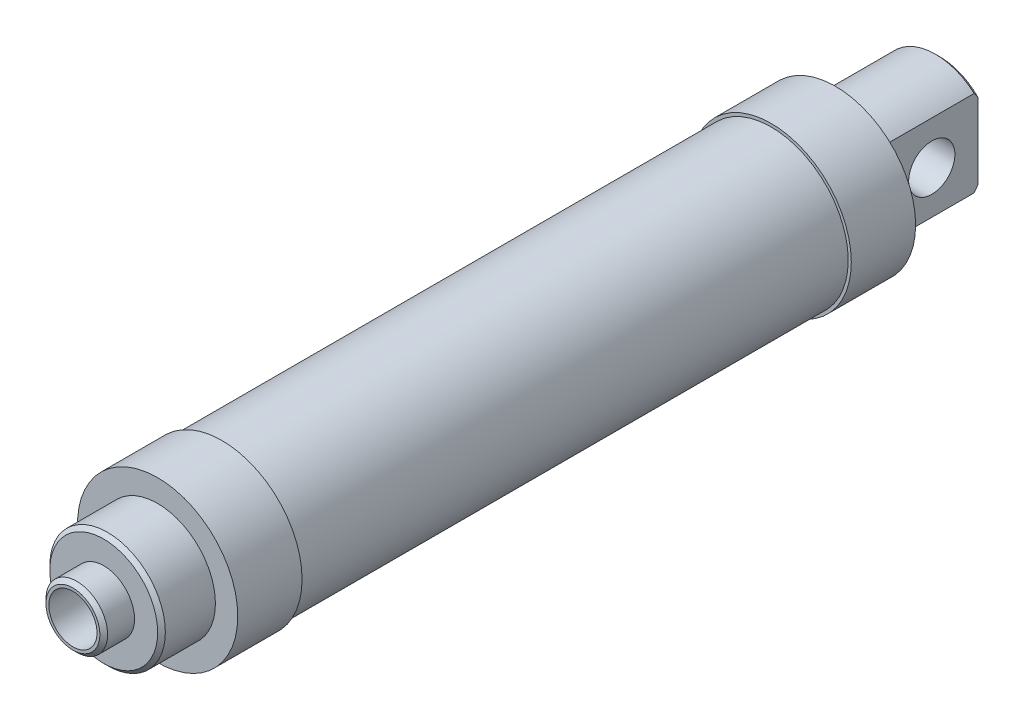
ISO-10303-21;
HEADER;
FILE_DESCRIPTION(('STEP AP214'),'2;1');
FILE_NAME('part.step','',(''),(''),'','','');
FILE_SCHEMA(('AUTOMOTIVE_DESIGN { 1 0 10303 214 1 1 1 1 }'));
ENDSEC;
DATA;
#1=APPLICATION_CONTEXT('core data for automotive mechanical design processes');
#2=APPLICATION_PROTOCOL_DEFINITION('international standard','automotive_design',2000,#1);
#3=PRODUCT_CONTEXT('',#1,'mechanical');
#4=PRODUCT('Part','Part','',(#3));
#5=PRODUCT_RELATED_PRODUCT_CATEGORY('part','',(#4));
#6=PRODUCT_DEFINITION_FORMATION('','',#4);
#7=PRODUCT_DEFINITION_CONTEXT('part definition',#1,'design');
#8=PRODUCT_DEFINITION('design','',#6,#7);
#9=PRODUCT_DEFINITION_SHAPE('','',#8);
#10=(LENGTH_UNIT() NAMED_UNIT(*) SI_UNIT(.MILLI.,.METRE.));
#11=(NAMED_UNIT(*) PLANE_ANGLE_UNIT() SI_UNIT($,.RADIAN.));
#12=(NAMED_UNIT(*) SI_UNIT($,.STERADIAN.) SOLID_ANGLE_UNIT());
#13=UNCERTAINTY_MEASURE_WITH_UNIT(LENGTH_MEASURE(1.E-05),#10,'distance_accuracy_value','');
#14=(GEOMETRIC_REPRESENTATION_CONTEXT(3) GLOBAL_UNCERTAINTY_ASSIGNED_CONTEXT((#13)) GLOBAL_UNIT_ASSIGNED_CONTEXT((#10,
#11,#12)) REPRESENTATION_CONTEXT('',''));
#15=CARTESIAN_POINT('',(0.,0.,0.));
#16=DIRECTION('',(0.,0.,1.));
#17=DIRECTION('',(1.,0.,0.));
#18=AXIS2_PLACEMENT_3D('',#15,#16,#17);
#19=CARTESIAN_POINT('',(0.,0.,142.6));
#20=DIRECTION('',(0.,0.,-1.));
#21=DIRECTION('',(-1.,0.,0.));
#22=AXIS2_PLACEMENT_3D('',#19,#20,#21);
#23=CYLINDRICAL_SURFACE('',#22,20.);
#24=CARTESIAN_POINT('',(0.,0.,142.6));
#25=DIRECTION('',(0.,0.,1.));
#26=DIRECTION('',(1.,0.,0.));
#27=AXIS2_PLACEMENT_3D('',#24,#25,#26);
#28=CIRCLE('',#27,20.);
#29=CARTESIAN_POINT('',(20.,0.,142.6));
#30=VERTEX_POINT('',#29);
#31=EDGE_CURVE('E131',#30,#30,#28,.T.);
#32=ORIENTED_EDGE('',*,*,#31,.F.);
#33=EDGE_LOOP('',(#32));
#34=FACE_BOUND('',#33,.T.);
#35=CARTESIAN_POINT('',(0.,0.,0.));
#36=DIRECTION('',(0.,0.,1.));
#37=DIRECTION('',(1.,0.,0.));
#38=AXIS2_PLACEMENT_3D('',#35,#36,#37);
#39=CIRCLE('',#38,20.);
#40=CARTESIAN_POINT('',(20.,0.,0.));
#41=VERTEX_POINT('',#40);
#42=EDGE_CURVE('E122',#41,#41,#39,.T.);
#43=ORIENTED_EDGE('',*,*,#42,.T.);
#44=EDGE_LOOP('',(#43));
#45=FACE_BOUND('',#44,.T.);
#46=ADVANCED_FACE('F33',(#34,#45),#23,.T.);
#47=CARTESIAN_POINT('',(0.,0.,159.3));
#48=DIRECTION('',(0.,0.,-1.));
#49=DIRECTION('',(-1.,0.,0.));
#50=AXIS2_PLACEMENT_3D('',#47,#48,#49);
#51=CYLINDRICAL_SURFACE('',#50,20.8);
#52=CARTESIAN_POINT('',(0.,0.,159.3));
#53=DIRECTION('',(0.,0.,1.));
#54=DIRECTION('',(1.,0.,0.));
#55=AXIS2_PLACEMENT_3D('',#52,#53,#54);
#56=CIRCLE('',#55,20.8);
#57=CARTESIAN_POINT('',(20.8,0.,159.3));
#58=VERTEX_POINT('',#57);
#59=EDGE_CURVE('E128',#58,#58,#56,.T.);
#60=ORIENTED_EDGE('',*,*,#59,.F.);
#61=EDGE_LOOP('',(#60));
#62=FACE_BOUND('',#61,.T.);
#63=CARTESIAN_POINT('',(0.,0.,142.6));
#64=DIRECTION('',(0.,0.,1.));
#65=DIRECTION('',(1.,0.,0.));
#66=AXIS2_PLACEMENT_3D('',#63,#64,#65);
#67=CIRCLE('',#66,20.8);
#68=CARTESIAN_POINT('',(20.8,0.,142.6));
#69=VERTEX_POINT('',#68);
#70=EDGE_CURVE('E127',#69,#69,#67,.T.);
#71=ORIENTED_EDGE('',*,*,#70,.T.);
#72=EDGE_LOOP('',(#71));
#73=FACE_BOUND('',#72,.T.);
#74=ADVANCED_FACE('F197',(#62,#73),#51,.T.);
#75=CARTESIAN_POINT('',(0.,0.,159.3));
#76=DIRECTION('',(0.,0.,1.));
#77=DIRECTION('',(1.,0.,0.));
#78=AXIS2_PLACEMENT_3D('',#75,#76,#77);
#79=PLANE('',#78);
#80=CARTESIAN_POINT('',(0.,0.,159.3));
#81=DIRECTION('',(0.,0.,1.));
#82=DIRECTION('',(1.,0.,0.));
#83=AXIS2_PLACEMENT_3D('',#80,#81,#82);
#84=CIRCLE('',#83,15.);
#85=CARTESIAN_POINT('',(15.,0.,159.3));
#86=VERTEX_POINT('',#85);
#87=EDGE_CURVE('E269',#86,#86,#84,.T.);
#88=ORIENTED_EDGE('',*,*,#87,.F.);
#89=EDGE_LOOP('',(#88));
#90=FACE_BOUND('',#89,.T.);
#91=ORIENTED_EDGE('',*,*,#59,.T.);
#92=EDGE_LOOP('',(#91));
#93=FACE_BOUND('',#92,.T.);
#94=ADVANCED_FACE('F194',(#90,#93),#79,.T.);
#95=CARTESIAN_POINT('',(0.,0.,142.6));
#96=DIRECTION('',(0.,0.,1.));
#97=DIRECTION('',(1.,0.,0.));
#98=AXIS2_PLACEMENT_3D('',#95,#96,#97);
#99=PLANE('',#98);
#100=ORIENTED_EDGE('',*,*,#31,.T.);
#101=EDGE_LOOP('',(#100));
#102=FACE_BOUND('',#101,.T.);
#103=ORIENTED_EDGE('',*,*,#70,.F.);
#104=EDGE_LOOP('',(#103));
#105=FACE_BOUND('',#104,.T.);
#106=ADVANCED_FACE('F192',(#102,#105),#99,.F.);
#107=CARTESIAN_POINT('',(0.,0.,-16.7));
#108=DIRECTION('',(0.,0.,1.));
#109=DIRECTION('',(1.,0.,0.));
#110=AXIS2_PLACEMENT_3D('',#107,#108,#109);
#111=CYLINDRICAL_SURFACE('',#110,20.8);
#112=CARTESIAN_POINT('',(0.,0.,-16.7));
#113=DIRECTION('',(0.,0.,1.));
#114=DIRECTION('',(1.,0.,0.));
#115=AXIS2_PLACEMENT_3D('',#112,#113,#114);
#116=CIRCLE('',#115,20.8);
#117=CARTESIAN_POINT('',(20.8,0.,-16.7));
#118=VERTEX_POINT('',#117);
#119=EDGE_CURVE('E119',#118,#118,#116,.T.);
#120=ORIENTED_EDGE('',*,*,#119,.T.);
#121=EDGE_LOOP('',(#120));
#122=FACE_BOUND('',#121,.T.);
#123=CARTESIAN_POINT('',(0.,0.,0.));
#124=DIRECTION('',(0.,0.,1.));
#125=DIRECTION('',(1.,0.,0.));
#126=AXIS2_PLACEMENT_3D('',#123,#124,#125);
#127=CIRCLE('',#126,20.8);
#128=CARTESIAN_POINT('',(20.8,0.,0.));
#129=VERTEX_POINT('',#128);
#130=EDGE_CURVE('E118',#129,#129,#127,.T.);
#131=ORIENTED_EDGE('',*,*,#130,.F.);
#132=EDGE_LOOP('',(#131));
#133=FACE_BOUND('',#132,.T.);
#134=ADVANCED_FACE('F185',(#122,#133),#111,.T.);
#135=CARTESIAN_POINT('',(0.,0.,-16.7));
#136=DIRECTION('',(0.,0.,1.));
#137=DIRECTION('',(1.,0.,0.));
#138=AXIS2_PLACEMENT_3D('',#135,#136,#137);
#139=PLANE('',#138);
#140=CARTESIAN_POINT('',(0.,0.,-16.7));
#141=DIRECTION('',(0.,0.,1.));
#142=DIRECTION('',(1.,0.,0.));
#143=AXIS2_PLACEMENT_3D('',#140,#141,#142);
#144=CIRCLE('',#143,15.);
#145=CARTESIAN_POINT('',(15.,0.,-16.7));
#146=VERTEX_POINT('',#145);
#147=EDGE_CURVE('E136',#146,#146,#144,.F.);
#148=ORIENTED_EDGE('',*,*,#147,.F.);
#149=EDGE_LOOP('',(#148));
#150=FACE_BOUND('',#149,.T.);
#151=ORIENTED_EDGE('',*,*,#119,.F.);
#152=EDGE_LOOP('',(#151));
#153=FACE_BOUND('',#152,.T.);
#154=ADVANCED_FACE('F182',(#150,#153),#139,.F.);
#155=CARTESIAN_POINT('',(0.,0.,0.));
#156=DIRECTION('',(0.,0.,1.));
#157=DIRECTION('',(1.,0.,0.));
#158=AXIS2_PLACEMENT_3D('',#155,#156,#157);
#159=PLANE('',#158);
#160=ORIENTED_EDGE('',*,*,#42,.F.);
#161=EDGE_LOOP('',(#160));
#162=FACE_BOUND('',#161,.T.);
#163=ORIENTED_EDGE('',*,*,#130,.T.);
#164=EDGE_LOOP('',(#163));
#165=FACE_BOUND('',#164,.T.);
#166=ADVANCED_FACE('F181',(#162,#165),#159,.T.);
#167=CARTESIAN_POINT('',(0.,0.,-43.7));
#168=DIRECTION('',(0.,0.,1.));
#169=DIRECTION('',(1.,0.,0.));
#170=AXIS2_PLACEMENT_3D('',#167,#168,#169);
#171=CYLINDRICAL_SURFACE('',#170,15.);
#172=DIRECTION('',(0.,0.,1.));
#173=VECTOR('',#172,1.);
#174=CARTESIAN_POINT('',(9.99999999999999,11.180339887499,-43.7));
#175=LINE('',#174,#173);
#176=CARTESIAN_POINT('',(10.,11.180339887499,-17.7));
#177=VERTEX_POINT('',#176);
#178=CARTESIAN_POINT('',(9.99999999999999,11.180339887499,-42.7));
#179=VERTEX_POINT('',#178);
#180=EDGE_CURVE('E114',#177,#179,#175,.F.);
#181=ORIENTED_EDGE('',*,*,#180,.T.);
#182=CARTESIAN_POINT('',(0.,0.,-42.7));
#183=DIRECTION('',(0.,0.,-1.));
#184=DIRECTION('',(-1.,0.,0.));
#185=AXIS2_PLACEMENT_3D('',#182,#183,#184);
#186=CIRCLE('',#185,15.);
#187=CARTESIAN_POINT('',(-9.99999999999999,11.180339887499,-42.7));
#188=VERTEX_POINT('',#187);
#189=EDGE_CURVE('E56',#179,#188,#186,.F.);
#190=ORIENTED_EDGE('',*,*,#189,.T.);
#191=DIRECTION('',(0.,0.,1.));
#192=VECTOR('',#191,1.);
#193=CARTESIAN_POINT('',(-9.99999999999999,11.180339887499,-43.7));
#194=LINE('',#193,#192);
#195=CARTESIAN_POINT('',(-10.,11.180339887499,-17.7));
#196=VERTEX_POINT('',#195);
#197=EDGE_CURVE('E85',#188,#196,#194,.T.);
#198=ORIENTED_EDGE('',*,*,#197,.T.);
#199=CARTESIAN_POINT('',(0.,0.,-17.7));
#200=DIRECTION('',(0.,0.,1.));
#201=DIRECTION('',(1.,0.,0.));
#202=AXIS2_PLACEMENT_3D('',#199,#200,#201);
#203=CIRCLE('',#202,15.);
#204=CARTESIAN_POINT('',(-10.,-11.180339887499,-17.7));
#205=VERTEX_POINT('',#204);
#206=EDGE_CURVE('E89',#196,#205,#203,.T.);
#207=ORIENTED_EDGE('',*,*,#206,.T.);
#208=DIRECTION('',(0.,0.,1.));
#209=VECTOR('',#208,1.);
#210=CARTESIAN_POINT('',(-9.99999999999999,-11.180339887499,-43.7));
#211=LINE('',#210,#209);
#212=CARTESIAN_POINT('',(-9.99999999999999,-11.180339887499,-42.7));
#213=VERTEX_POINT('',#212);
#214=EDGE_CURVE('E93',#205,#213,#211,.F.);
#215=ORIENTED_EDGE('',*,*,#214,.T.);
#216=CARTESIAN_POINT('',(0.,0.,-42.7));
#217=DIRECTION('',(0.,0.,-1.));
#218=DIRECTION('',(-1.,0.,0.));
#219=AXIS2_PLACEMENT_3D('',#216,#217,#218);
#220=CIRCLE('',#219,15.);
#221=CARTESIAN_POINT('',(9.99999999999999,-11.180339887499,-42.7));
#222=VERTEX_POINT('',#221);
#223=EDGE_CURVE('E288',#213,#222,#220,.F.);
#224=ORIENTED_EDGE('',*,*,#223,.T.);
#225=DIRECTION('',(0.,0.,1.));
#226=VECTOR('',#225,1.);
#227=CARTESIAN_POINT('',(9.99999999999999,-11.180339887499,-43.7));
#228=LINE('',#227,#226);
#229=CARTESIAN_POINT('',(10.,-11.180339887499,-17.7));
#230=VERTEX_POINT('',#229);
#231=EDGE_CURVE('E116',#222,#230,#228,.T.);
#232=ORIENTED_EDGE('',*,*,#231,.T.);
#233=CARTESIAN_POINT('',(0.,0.,-17.7));
#234=DIRECTION('',(0.,0.,1.));
#235=DIRECTION('',(1.,0.,0.));
#236=AXIS2_PLACEMENT_3D('',#233,#234,#235);
#237=CIRCLE('',#236,15.);
#238=EDGE_CURVE('E142',#230,#177,#237,.T.);
#239=ORIENTED_EDGE('',*,*,#238,.T.);
#240=EDGE_LOOP('',(#181,#190,#198,#207,#215,#224,#232,#239));
#241=FACE_BOUND('',#240,.T.);
#242=ORIENTED_EDGE('',*,*,#147,.T.);
#243=EDGE_LOOP('',(#242));
#244=FACE_BOUND('',#243,.T.);
#245=ADVANCED_FACE('F87',(#241,#244),#171,.T.);
#246=CARTESIAN_POINT('',(0.,0.,-43.7));
#247=DIRECTION('',(0.,0.,-1.));
#248=DIRECTION('',(-1.,0.,0.));
#249=AXIS2_PLACEMENT_3D('',#246,#247,#248);
#250=PLANE('',#249);
#251=DIRECTION('',(0.,-1.,0.));
#252=VECTOR('',#251,1.);
#253=CARTESIAN_POINT('',(-10.,0.,-43.7));
#254=LINE('',#253,#252);
#255=CARTESIAN_POINT('',(-10.,9.79795897113273,-43.7));
#256=VERTEX_POINT('',#255);
#257=CARTESIAN_POINT('',(-10.,-9.79795897113273,-43.7));
#258=VERTEX_POINT('',#257);
#259=EDGE_CURVE('E100',#256,#258,#254,.T.);
#260=ORIENTED_EDGE('',*,*,#259,.F.);
#261=CARTESIAN_POINT('',(0.,0.,-43.7));
#262=DIRECTION('',(0.,0.,-1.));
#263=DIRECTION('',(-1.,0.,0.));
#264=AXIS2_PLACEMENT_3D('',#261,#262,#263);
#265=CIRCLE('',#264,14.);
#266=CARTESIAN_POINT('',(10.,9.79795897113273,-43.7));
#267=VERTEX_POINT('',#266);
#268=EDGE_CURVE('E148',#256,#267,#265,.T.);
#269=ORIENTED_EDGE('',*,*,#268,.T.);
#270=DIRECTION('',(0.,1.,0.));
#271=VECTOR('',#270,1.);
#272=CARTESIAN_POINT('',(10.,0.,-43.7));
#273=LINE('',#272,#271);
#274=CARTESIAN_POINT('',(10.,-9.79795897113273,-43.7));
#275=VERTEX_POINT('',#274);
#276=EDGE_CURVE('E139',#275,#267,#273,.T.);
#277=ORIENTED_EDGE('',*,*,#276,.F.);
#278=CARTESIAN_POINT('',(0.,0.,-43.7));
#279=DIRECTION('',(0.,0.,-1.));
#280=DIRECTION('',(-1.,0.,0.));
#281=AXIS2_PLACEMENT_3D('',#278,#279,#280);
#282=CIRCLE('',#281,14.);
#283=EDGE_CURVE('E99',#275,#258,#282,.T.);
#284=ORIENTED_EDGE('',*,*,#283,.T.);
#285=EDGE_LOOP('',(#260,#269,#277,#284));
#286=FACE_BOUND('',#285,.T.);
#287=ADVANCED_FACE('F174',(#286),#250,.T.);
#288=CARTESIAN_POINT('',(0.,0.,-17.7));
#289=DIRECTION('',(0.,0.,1.));
#290=DIRECTION('',(1.,0.,0.));
#291=AXIS2_PLACEMENT_3D('',#288,#289,#290);
#292=PLANE('',#291);
#293=DIRECTION('',(0.,1.,0.));
#294=VECTOR('',#293,1.);
#295=CARTESIAN_POINT('',(10.,15.,-17.7));
#296=LINE('',#295,#294);
#297=EDGE_CURVE('E92',#230,#177,#296,.T.);
#298=ORIENTED_EDGE('',*,*,#297,.T.);
#299=ORIENTED_EDGE('',*,*,#238,.F.);
#300=EDGE_LOOP('',(#298,#299));
#301=FACE_BOUND('',#300,.T.);
#302=ADVANCED_FACE('F171',(#301),#292,.F.);
#303=CARTESIAN_POINT('',(10.,15.,-17.7));
#304=DIRECTION('',(-1.,0.,0.));
#305=DIRECTION('',(0.,0.,1.));
#306=AXIS2_PLACEMENT_3D('',#303,#304,#305);
#307=PLANE('',#306);
#308=CARTESIAN_POINT('',(10.,0.,-31.7));
#309=DIRECTION('',(1.,0.,0.));
#310=DIRECTION('',(0.,0.,-1.));
#311=AXIS2_PLACEMENT_3D('',#308,#309,#310);
#312=CIRCLE('',#311,6.);
#313=CARTESIAN_POINT('',(10.,0.,-37.7));
#314=VERTEX_POINT('',#313);
#315=EDGE_CURVE('E107',#314,#314,#312,.T.);
#316=ORIENTED_EDGE('',*,*,#315,.F.);
#317=EDGE_LOOP('',(#316));
#318=FACE_BOUND('',#317,.T.);
#319=ORIENTED_EDGE('',*,*,#276,.T.);
#320=CARTESIAN_POINT('',(10.,9.79795897113273,-43.7));
#321=CARTESIAN_POINT('',(10.,9.9144528340522,-43.6184698842031));
#322=CARTESIAN_POINT('',(10.,10.0305989753392,-43.5364440774601));
#323=CARTESIAN_POINT('',(10.,10.2622268930584,-43.3714731324367));
#324=CARTESIAN_POINT('',(10.,10.3777087061234,-43.2885280456002));
#325=CARTESIAN_POINT('',(10.,10.6080513507817,-43.1217819738915));
#326=CARTESIAN_POINT('',(10.,10.7229121859285,-43.0379809939246));
#327=CARTESIAN_POINT('',(10.,10.9520540255817,-42.8695765798571));
#328=CARTESIAN_POINT('',(10.,11.0663349974492,-42.7849731013384));
#329=CARTESIAN_POINT('',(10.,11.180339887499,-42.7));
#330=B_SPLINE_CURVE_WITH_KNOTS('',3,(#320,#321,#322,#323,#324,#325,#326,#327,#328,#329),
.UNSPECIFIED.,.F.,.F.,(4,2,2,2,4),(0.,0.426567590976712,0.853111430127962,1.27965282597467,
1.70621797007618),.UNSPECIFIED.);
#331=EDGE_CURVE('E158',#267,#179,#330,.T.);
#332=ORIENTED_EDGE('',*,*,#331,.T.);
#333=ORIENTED_EDGE('',*,*,#180,.F.);
#334=ORIENTED_EDGE('',*,*,#297,.F.);
#335=ORIENTED_EDGE('',*,*,#231,.F.);
#336=CARTESIAN_POINT('',(9.99999999999999,-11.180339887499,-42.7));
#337=CARTESIAN_POINT('',(10.,-11.0663349974492,-42.7849731013384));
#338=CARTESIAN_POINT('',(10.,-10.9520540255817,-42.869576579857));
#339=CARTESIAN_POINT('',(10.,-10.7229121859285,-43.0379809939246));
#340=CARTESIAN_POINT('',(10.,-10.6080513507818,-43.1217819738915));
#341=CARTESIAN_POINT('',(10.,-10.3777087061234,-43.2885280456002));
#342=CARTESIAN_POINT('',(10.,-10.2622268930584,-43.3714731324367));
#343=CARTESIAN_POINT('',(10.,-10.0305989753392,-43.5364440774601));
#344=CARTESIAN_POINT('',(10.,-9.91445283405221,-43.6184698842031));
#345=CARTESIAN_POINT('',(10.,-9.79795897113276,-43.7));
#346=B_SPLINE_CURVE_WITH_KNOTS('',3,(#336,#337,#338,#339,#340,#341,#342,#343,#344,#345),
.UNSPECIFIED.,.F.,.F.,(4,2,2,2,4),(0.,0.426565144101508,0.853106539948218,1.27965037909946,
1.70621797007618),.UNSPECIFIED.);
#347=EDGE_CURVE('E151',#222,#275,#346,.T.);
#348=ORIENTED_EDGE('',*,*,#347,.T.);
#349=EDGE_LOOP('',(#319,#332,#333,#334,#335,#348));
#350=FACE_BOUND('',#349,.T.);
#351=ADVANCED_FACE('F166',(#318,#350),#307,.F.);
#352=CARTESIAN_POINT('',(0.,0.,-17.7));
#353=DIRECTION('',(0.,0.,1.));
#354=DIRECTION('',(1.,0.,0.));
#355=AXIS2_PLACEMENT_3D('',#352,#353,#354);
#356=PLANE('',#355);
#357=DIRECTION('',(0.,-1.,0.));
#358=VECTOR('',#357,1.);
#359=CARTESIAN_POINT('',(-10.,15.,-17.7));
#360=LINE('',#359,#358);
#361=EDGE_CURVE('E98',#196,#205,#360,.T.);
#362=ORIENTED_EDGE('',*,*,#361,.T.);
#363=ORIENTED_EDGE('',*,*,#206,.F.);
#364=EDGE_LOOP('',(#362,#363));
#365=FACE_BOUND('',#364,.T.);
#366=ADVANCED_FACE('F97',(#365),#356,.F.);
#367=CARTESIAN_POINT('',(-10.,15.,-17.7));
#368=DIRECTION('',(1.,0.,0.));
#369=DIRECTION('',(0.,0.,-1.));
#370=AXIS2_PLACEMENT_3D('',#367,#368,#369);
#371=PLANE('',#370);
#372=CARTESIAN_POINT('',(-10.,0.,-31.7));
#373=DIRECTION('',(1.,0.,0.));
#374=DIRECTION('',(0.,0.,-1.));
#375=AXIS2_PLACEMENT_3D('',#372,#373,#374);
#376=CIRCLE('',#375,6.);
#377=CARTESIAN_POINT('',(-10.,0.,-37.7));
#378=VERTEX_POINT('',#377);
#379=EDGE_CURVE('E103',#378,#378,#376,.T.);
#380=ORIENTED_EDGE('',*,*,#379,.T.);
#381=EDGE_LOOP('',(#380));
#382=FACE_BOUND('',#381,.T.);
#383=ORIENTED_EDGE('',*,*,#197,.F.);
#384=CARTESIAN_POINT('',(-9.99999999999999,11.180339887499,-42.7));
#385=CARTESIAN_POINT('',(-10.,11.0663349974492,-42.7849731013384));
#386=CARTESIAN_POINT('',(-10.,10.9520540255817,-42.869576579857));
#387=CARTESIAN_POINT('',(-10.,10.7229121859285,-43.0379809939246));
#388=CARTESIAN_POINT('',(-10.,10.6080513507818,-43.1217819738915));
#389=CARTESIAN_POINT('',(-10.,10.3777087061234,-43.2885280456002));
#390=CARTESIAN_POINT('',(-10.,10.2622268930584,-43.3714731324367));
#391=CARTESIAN_POINT('',(-10.,10.0305989753392,-43.5364440774601));
#392=CARTESIAN_POINT('',(-10.,9.91445283405221,-43.6184698842031));
#393=CARTESIAN_POINT('',(-10.,9.79795897113276,-43.7));
#394=B_SPLINE_CURVE_WITH_KNOTS('',3,(#384,#385,#386,#387,#388,#389,#390,#391,#392,#393),
.UNSPECIFIED.,.F.,.F.,(4,2,2,2,4),(0.,0.426565144101508,0.853106539948218,1.27965037909946,
1.70621797007618),.UNSPECIFIED.);
#395=EDGE_CURVE('E214',#188,#256,#394,.T.);
#396=ORIENTED_EDGE('',*,*,#395,.T.);
#397=ORIENTED_EDGE('',*,*,#259,.T.);
#398=CARTESIAN_POINT('',(-10.,-9.79795897113273,-43.7));
#399=CARTESIAN_POINT('',(-10.,-9.9144528340522,-43.6184698842031));
#400=CARTESIAN_POINT('',(-10.,-10.0305989753392,-43.5364440774601));
#401=CARTESIAN_POINT('',(-10.,-10.2622268930584,-43.3714731324367));
#402=CARTESIAN_POINT('',(-10.,-10.3777087061234,-43.2885280456002));
#403=CARTESIAN_POINT('',(-10.,-10.6080513507817,-43.1217819738915));
#404=CARTESIAN_POINT('',(-10.,-10.7229121859285,-43.0379809939246));
#405=CARTESIAN_POINT('',(-10.,-10.9520540255817,-42.8695765798571));
#406=CARTESIAN_POINT('',(-10.,-11.0663349974492,-42.7849731013384));
#407=CARTESIAN_POINT('',(-10.,-11.180339887499,-42.7));
#408=B_SPLINE_CURVE_WITH_KNOTS('',3,(#398,#399,#400,#401,#402,#403,#404,#405,#406,#407),
.UNSPECIFIED.,.F.,.F.,(4,2,2,2,4),(0.,0.426567590976712,0.853111430127962,1.27965282597467,
1.70621797007618),.UNSPECIFIED.);
#409=EDGE_CURVE('E48',#258,#213,#408,.T.);
#410=ORIENTED_EDGE('',*,*,#409,.T.);
#411=ORIENTED_EDGE('',*,*,#214,.F.);
#412=ORIENTED_EDGE('',*,*,#361,.F.);
#413=EDGE_LOOP('',(#383,#396,#397,#410,#411,#412));
#414=FACE_BOUND('',#413,.T.);
#415=ADVANCED_FACE('F102',(#382,#414),#371,.F.);
#416=CARTESIAN_POINT('',(-20.8,0.,-31.7));
#417=DIRECTION('',(1.,0.,0.));
#418=DIRECTION('',(0.,0.,-1.));
#419=AXIS2_PLACEMENT_3D('',#416,#417,#418);
#420=CYLINDRICAL_SURFACE('',#419,6.);
#421=CARTESIAN_POINT('',(10.,0.,-37.7));
#422=CARTESIAN_POINT('',(9.79166666666667,0.,-37.7));
#423=CARTESIAN_POINT('',(9.58333333333333,0.,-37.7));
#424=CARTESIAN_POINT('',(9.16666666666666,0.,-37.7));
#425=CARTESIAN_POINT('',(8.95833333333333,0.,-37.7));
#426=CARTESIAN_POINT('',(8.54166666666666,0.,-37.7));
#427=CARTESIAN_POINT('',(8.33333333333333,0.,-37.7));
#428=CARTESIAN_POINT('',(7.91666666666666,0.,-37.7));
#429=CARTESIAN_POINT('',(7.70833333333333,0.,-37.7));
#430=CARTESIAN_POINT('',(7.29166666666667,0.,-37.7));
#431=CARTESIAN_POINT('',(7.08333333333333,0.,-37.7));
#432=CARTESIAN_POINT('',(6.66666666666667,0.,-37.7));
#433=CARTESIAN_POINT('',(6.45833333333333,0.,-37.7));
#434=CARTESIAN_POINT('',(6.04166666666667,0.,-37.7));
#435=CARTESIAN_POINT('',(5.83333333333333,0.,-37.7));
#436=CARTESIAN_POINT('',(5.41666666666666,0.,-37.7));
#437=CARTESIAN_POINT('',(5.20833333333333,0.,-37.7));
#438=CARTESIAN_POINT('',(4.79166666666667,0.,-37.7));
#439=CARTESIAN_POINT('',(4.58333333333333,0.,-37.7));
#440=CARTESIAN_POINT('',(4.16666666666667,0.,-37.7));
#441=CARTESIAN_POINT('',(3.95833333333333,0.,-37.7));
#442=CARTESIAN_POINT('',(3.54166666666667,0.,-37.7));
#443=CARTESIAN_POINT('',(3.33333333333333,0.,-37.7));
#444=CARTESIAN_POINT('',(2.91666666666667,0.,-37.7));
#445=CARTESIAN_POINT('',(2.70833333333333,0.,-37.7));
#446=CARTESIAN_POINT('',(2.29166666666667,0.,-37.7));
#447=CARTESIAN_POINT('',(2.08333333333333,0.,-37.7));
#448=CARTESIAN_POINT('',(1.66666666666666,0.,-37.7));
#449=CARTESIAN_POINT('',(1.45833333333333,0.,-37.7));
#450=CARTESIAN_POINT('',(1.04166666666666,0.,-37.7));
#451=CARTESIAN_POINT('',(0.833333333333331,0.,-37.7));
#452=CARTESIAN_POINT('',(0.416666666666664,0.,-37.7));
#453=CARTESIAN_POINT('',(0.20833333333333,0.,-37.7));
#454=CARTESIAN_POINT('',(-0.208333333333337,0.,-37.7));
#455=CARTESIAN_POINT('',(-0.416666666666671,0.,-37.7));
#456=CARTESIAN_POINT('',(-0.833333333333336,0.,-37.7));
#457=CARTESIAN_POINT('',(-1.04166666666667,0.,-37.7));
#458=CARTESIAN_POINT('',(-1.45833333333333,0.,-37.7));
#459=CARTESIAN_POINT('',(-1.66666666666667,0.,-37.7));
#460=CARTESIAN_POINT('',(-2.08333333333334,0.,-37.7));
#461=CARTESIAN_POINT('',(-2.29166666666667,0.,-37.7));
#462=CARTESIAN_POINT('',(-2.70833333333333,0.,-37.7));
#463=CARTESIAN_POINT('',(-2.91666666666667,0.,-37.7));
#464=CARTESIAN_POINT('',(-3.33333333333333,0.,-37.7));
#465=CARTESIAN_POINT('',(-3.54166666666667,0.,-37.7));
#466=CARTESIAN_POINT('',(-3.95833333333333,0.,-37.7));
#467=CARTESIAN_POINT('',(-4.16666666666667,0.,-37.7));
#468=CARTESIAN_POINT('',(-4.58333333333333,0.,-37.7));
#469=CARTESIAN_POINT('',(-4.79166666666667,0.,-37.7));
#470=CARTESIAN_POINT('',(-5.20833333333333,0.,-37.7));
#471=CARTESIAN_POINT('',(-5.41666666666667,0.,-37.7));
#472=CARTESIAN_POINT('',(-5.83333333333333,0.,-37.7));
#473=CARTESIAN_POINT('',(-6.04166666666667,0.,-37.7));
#474=CARTESIAN_POINT('',(-6.45833333333333,0.,-37.7));
#475=CARTESIAN_POINT('',(-6.66666666666667,0.,-37.7));
#476=CARTESIAN_POINT('',(-7.08333333333333,0.,-37.7));
#477=CARTESIAN_POINT('',(-7.29166666666667,0.,-37.7));
#478=CARTESIAN_POINT('',(-7.70833333333333,0.,-37.7));
#479=CARTESIAN_POINT('',(-7.91666666666667,0.,-37.7));
#480=CARTESIAN_POINT('',(-8.33333333333333,0.,-37.7));
#481=CARTESIAN_POINT('',(-8.54166666666667,0.,-37.7));
#482=CARTESIAN_POINT('',(-8.95833333333333,0.,-37.7));
#483=CARTESIAN_POINT('',(-9.16666666666667,0.,-37.7));
#484=CARTESIAN_POINT('',(-9.58333333333333,0.,-37.7));
#485=CARTESIAN_POINT('',(-9.79166666666667,0.,-37.7));
#486=CARTESIAN_POINT('',(-10.,0.,-37.7));
#487=B_SPLINE_CURVE_WITH_KNOTS('',3,(#421,#422,#423,#424,#425,#426,#427,#428,#429,#430,#431,
#432,#433,#434,#435,#436,#437,#438,#439,#440,#441,#442,#443,#444,#445,#446,#447,#448,#449,#450,
#451,#452,#453,#454,#455,#456,#457,#458,#459,#460,#461,#462,#463,#464,#465,#466,#467,#468,#469,
#470,#471,#472,#473,#474,#475,#476,#477,#478,#479,#480,#481,#482,#483,#484,#485,#486),
.UNSPECIFIED.,.F.,.F.,(4,2,2,2,2,2,2,2,2,2,2,2,2,2,2,2,2,2,2,2,2,2,2,2,2,2,2,2,2,2,2,2,4),(0.,
0.625000000000001,1.25,1.875,2.5,3.125,3.75,4.375,5.,5.625,6.25,6.875,7.5,8.125,8.75,9.375,10.,
10.625,11.25,11.875,12.5,13.125,13.75,14.375,15.,15.625,16.25,16.875,17.5,18.125,18.75,19.375,
20.),.UNSPECIFIED.);
#488=EDGE_CURVE('BSEAM210',#314,#378,#487,.T.);
#489=ORIENTED_EDGE('',*,*,#315,.T.);
#490=ORIENTED_EDGE('',*,*,#379,.F.);
#491=ORIENTED_EDGE('',*,*,#488,.T.);
#492=ORIENTED_EDGE('',*,*,#488,.F.);
#493=EDGE_LOOP('',(#489,#491,#490,#492));
#494=FACE_BOUND('',#493,.T.);
#495=ADVANCED_FACE('F210',(#494),#420,.F.);
#496=CARTESIAN_POINT('',(0.,0.,-43.7));
#497=DIRECTION('',(0.,0.,1.));
#498=DIRECTION('',(1.,0.,0.));
#499=AXIS2_PLACEMENT_3D('',#496,#497,#498);
#500=CONICAL_SURFACE('',#499,14.,0.785398163397435);
#501=ORIENTED_EDGE('',*,*,#395,.F.);
#502=ORIENTED_EDGE('',*,*,#189,.F.);
#503=ORIENTED_EDGE('',*,*,#331,.F.);
#504=ORIENTED_EDGE('',*,*,#268,.F.);
#505=EDGE_LOOP('',(#501,#502,#503,#504));
#506=FACE_BOUND('',#505,.T.);
#507=ADVANCED_FACE('F207',(#506),#500,.T.);
#508=CARTESIAN_POINT('',(0.,0.,-43.7));
#509=DIRECTION('',(0.,0.,1.));
#510=DIRECTION('',(1.,0.,0.));
#511=AXIS2_PLACEMENT_3D('',#508,#509,#510);
#512=CONICAL_SURFACE('',#511,14.,0.785398163397435);
#513=ORIENTED_EDGE('',*,*,#347,.F.);
#514=ORIENTED_EDGE('',*,*,#223,.F.);
#515=ORIENTED_EDGE('',*,*,#409,.F.);
#516=ORIENTED_EDGE('',*,*,#283,.F.);
#517=EDGE_LOOP('',(#513,#514,#515,#516));
#518=FACE_BOUND('',#517,.T.);
#519=ADVANCED_FACE('F164',(#518),#512,.T.);
#520=CARTESIAN_POINT('',(0.,0.,173.3));
#521=DIRECTION('',(0.,0.,-1.));
#522=DIRECTION('',(-1.,0.,0.));
#523=AXIS2_PLACEMENT_3D('',#520,#521,#522);
#524=CYLINDRICAL_SURFACE('',#523,15.);
#525=CARTESIAN_POINT('',(0.,0.,172.3));
#526=DIRECTION('',(0.,0.,1.));
#527=DIRECTION('',(1.,0.,0.));
#528=AXIS2_PLACEMENT_3D('',#525,#526,#527);
#529=CIRCLE('',#528,15.);
#530=CARTESIAN_POINT('',(15.,0.,172.3));
#531=VERTEX_POINT('',#530);
#532=EDGE_CURVE('E11',#531,#531,#529,.F.);
#533=ORIENTED_EDGE('',*,*,#532,.T.);
#534=EDGE_LOOP('',(#533));
#535=FACE_BOUND('',#534,.T.);
#536=ORIENTED_EDGE('',*,*,#87,.T.);
#537=EDGE_LOOP('',(#536));
#538=FACE_BOUND('',#537,.T.);
#539=ADVANCED_FACE('F236',(#535,#538),#524,.T.);
#540=CARTESIAN_POINT('',(0.,0.,173.3));
#541=DIRECTION('',(0.,0.,1.));
#542=DIRECTION('',(1.,0.,0.));
#543=AXIS2_PLACEMENT_3D('',#540,#541,#542);
#544=PLANE('',#543);
#545=CARTESIAN_POINT('',(0.,0.,173.3));
#546=DIRECTION('',(0.,0.,1.));
#547=DIRECTION('',(1.,0.,0.));
#548=AXIS2_PLACEMENT_3D('',#545,#546,#547);
#549=CIRCLE('',#548,14.);
#550=CARTESIAN_POINT('',(14.,0.,173.3));
#551=VERTEX_POINT('',#550);
#552=EDGE_CURVE('E41',#551,#551,#549,.T.);
#553=ORIENTED_EDGE('',*,*,#552,.T.);
#554=EDGE_LOOP('',(#553));
#555=FACE_BOUND('',#554,.T.);
#556=CARTESIAN_POINT('',(0.,0.,173.3));
#557=DIRECTION('',(0.,0.,1.));
#558=DIRECTION('',(1.,0.,0.));
#559=AXIS2_PLACEMENT_3D('',#556,#557,#558);
#560=CIRCLE('',#559,8.);
#561=CARTESIAN_POINT('',(8.,0.,173.3));
#562=VERTEX_POINT('',#561);
#563=EDGE_CURVE('E265',#562,#562,#560,.T.);
#564=ORIENTED_EDGE('',*,*,#563,.F.);
#565=EDGE_LOOP('',(#564));
#566=FACE_BOUND('',#565,.T.);
#567=ADVANCED_FACE('F239',(#555,#566),#544,.T.);
#568=CARTESIAN_POINT('',(0.,0.,181.3));
#569=DIRECTION('',(0.,0.,-1.));
#570=DIRECTION('',(-1.,0.,0.));
#571=AXIS2_PLACEMENT_3D('',#568,#569,#570);
#572=CYLINDRICAL_SURFACE('',#571,8.);
#573=CARTESIAN_POINT('',(0.,0.,180.3));
#574=DIRECTION('',(0.,0.,1.));
#575=DIRECTION('',(1.,0.,0.));
#576=AXIS2_PLACEMENT_3D('',#573,#574,#575);
#577=CIRCLE('',#576,8.);
#578=CARTESIAN_POINT('',(8.,0.,180.3));
#579=VERTEX_POINT('',#578);
#580=EDGE_CURVE('E444',#579,#579,#577,.F.);
#581=ORIENTED_EDGE('',*,*,#580,.T.);
#582=EDGE_LOOP('',(#581));
#583=FACE_BOUND('',#582,.T.);
#584=ORIENTED_EDGE('',*,*,#563,.T.);
#585=EDGE_LOOP('',(#584));
#586=FACE_BOUND('',#585,.T.);
#587=ADVANCED_FACE('F243',(#583,#586),#572,.T.);
#588=CARTESIAN_POINT('',(0.,0.,181.3));
#589=DIRECTION('',(0.,0.,1.));
#590=DIRECTION('',(1.,0.,0.));
#591=AXIS2_PLACEMENT_3D('',#588,#589,#590);
#592=PLANE('',#591);
#593=CARTESIAN_POINT('',(0.,0.,181.3));
#594=DIRECTION('',(0.,0.,1.));
#595=DIRECTION('',(1.,0.,0.));
#596=AXIS2_PLACEMENT_3D('',#593,#594,#595);
#597=CIRCLE('',#596,6.25);
#598=CARTESIAN_POINT('',(6.25,0.,181.3));
#599=VERTEX_POINT('',#598);
#600=EDGE_CURVE('E266',#599,#599,#597,.T.);
#601=ORIENTED_EDGE('',*,*,#600,.F.);
#602=EDGE_LOOP('',(#601));
#603=FACE_BOUND('',#602,.T.);
#604=CARTESIAN_POINT('',(0.,0.,181.3));
#605=DIRECTION('',(0.,0.,1.));
#606=DIRECTION('',(1.,0.,0.));
#607=AXIS2_PLACEMENT_3D('',#604,#605,#606);
#608=CIRCLE('',#607,7.00000000000003);
#609=CARTESIAN_POINT('',(7.00000000000003,0.,181.3));
#610=VERTEX_POINT('',#609);
#611=EDGE_CURVE('E220',#610,#610,#608,.T.);
#612=ORIENTED_EDGE('',*,*,#611,.T.);
#613=EDGE_LOOP('',(#612));
#614=FACE_BOUND('',#613,.T.);
#615=ADVANCED_FACE('F247',(#603,#614),#592,.T.);
#616=CARTESIAN_POINT('',(0.,0.,181.3));
#617=DIRECTION('',(0.,0.,-1.));
#618=DIRECTION('',(-1.,0.,0.));
#619=AXIS2_PLACEMENT_3D('',#616,#617,#618);
#620=CONICAL_SURFACE('',#619,7.00000000000003,0.785398163397431);
#621=ORIENTED_EDGE('',*,*,#580,.F.);
#622=EDGE_LOOP('',(#621));
#623=FACE_BOUND('',#622,.T.);
#624=ORIENTED_EDGE('',*,*,#611,.F.);
#625=EDGE_LOOP('',(#624));
#626=FACE_BOUND('',#625,.T.);
#627=ADVANCED_FACE('F251',(#623,#626),#620,.T.);
#628=CARTESIAN_POINT('',(0.,0.,173.3));
#629=DIRECTION('',(0.,0.,-1.));
#630=DIRECTION('',(-1.,0.,0.));
#631=AXIS2_PLACEMENT_3D('',#628,#629,#630);
#632=CONICAL_SURFACE('',#631,14.,0.785398163397442);
#633=ORIENTED_EDGE('',*,*,#532,.F.);
#634=EDGE_LOOP('',(#633));
#635=FACE_BOUND('',#634,.T.);
#636=ORIENTED_EDGE('',*,*,#552,.F.);
#637=EDGE_LOOP('',(#636));
#638=FACE_BOUND('',#637,.T.);
#639=ADVANCED_FACE('F35',(#635,#638),#632,.T.);
#640=CARTESIAN_POINT('',(0.,0.,81.3));
#641=DIRECTION('',(0.,0.,1.));
#642=DIRECTION('',(1.,0.,0.));
#643=AXIS2_PLACEMENT_3D('',#640,#641,#642);
#644=CYLINDRICAL_SURFACE('',#643,6.25);
#645=CARTESIAN_POINT('',(0.,0.,81.3));
#646=DIRECTION('',(0.,0.,1.));
#647=DIRECTION('',(1.,0.,0.));
#648=AXIS2_PLACEMENT_3D('',#645,#646,#647);
#649=CIRCLE('',#648,6.25);
#650=CARTESIAN_POINT('',(6.25,0.,81.3));
#651=VERTEX_POINT('',#650);
#652=EDGE_CURVE('E264',#651,#651,#649,.T.);
#653=ORIENTED_EDGE('',*,*,#652,.F.);
#654=EDGE_LOOP('',(#653));
#655=FACE_BOUND('',#654,.T.);
#656=ORIENTED_EDGE('',*,*,#600,.T.);
#657=EDGE_LOOP('',(#656));
#658=FACE_BOUND('',#657,.T.);
#659=ADVANCED_FACE('F253',(#655,#658),#644,.F.);
#660=CARTESIAN_POINT('',(0.,0.,81.3));
#661=DIRECTION('',(0.,0.,1.));
#662=DIRECTION('',(1.,0.,0.));
#663=AXIS2_PLACEMENT_3D('',#660,#661,#662);
#664=PLANE('',#663);
#665=ORIENTED_EDGE('',*,*,#652,.T.);
#666=EDGE_LOOP('',(#665));
#667=FACE_BOUND('',#666,.T.);
#668=ADVANCED_FACE('F256',(#667),#664,.T.);
#669=CLOSED_SHELL('',(#46,#74,#94,#106,#134,#154,#166,#245,#287,#302,#351,#366,#415,#495,#507,
#519,#539,#567,#587,#615,#627,#639,#659,#668));
#670=MANIFOLD_SOLID_BREP('B2',#669);
#671=ADVANCED_BREP_SHAPE_REPRESENTATION('',(#18,#670),#14);
#672=SHAPE_DEFINITION_REPRESENTATION(#9,#671);
ENDSEC;
END-ISO-10303-21;
